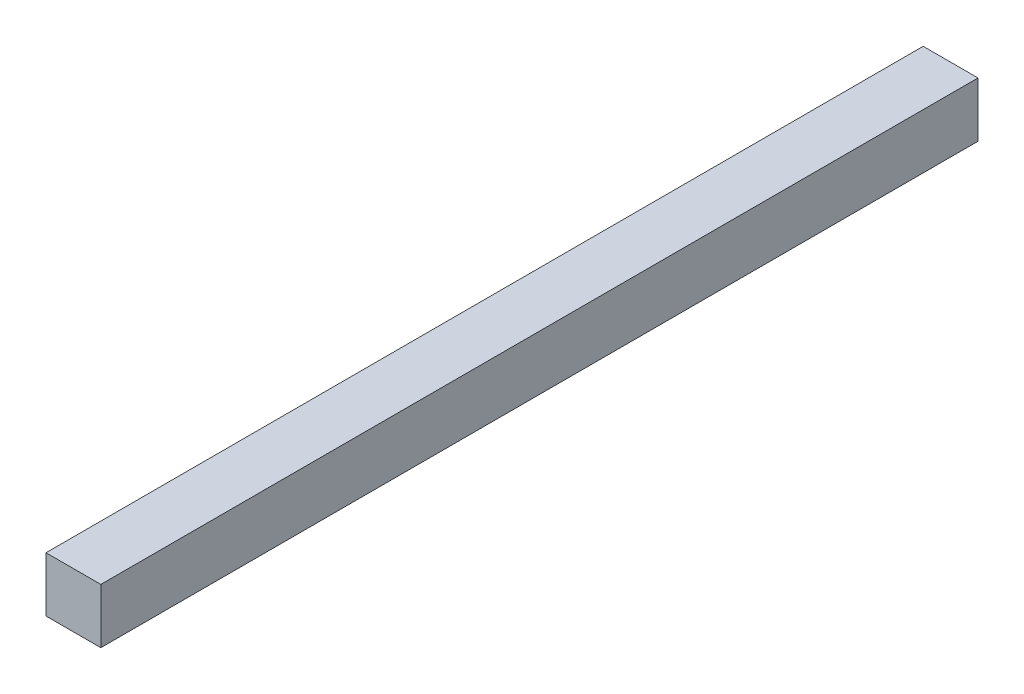
ISO-10303-21;
HEADER;
FILE_DESCRIPTION(('STEP AP214'),'2;1');
FILE_NAME('part.step','',(''),(''),'','','');
FILE_SCHEMA(('AUTOMOTIVE_DESIGN { 1 0 10303 214 1 1 1 1 }'));
ENDSEC;
DATA;
#1=APPLICATION_CONTEXT('core data for automotive mechanical design processes');
#2=APPLICATION_PROTOCOL_DEFINITION('international standard','automotive_design',2000,#1);
#3=PRODUCT_CONTEXT('',#1,'mechanical');
#4=PRODUCT('Part','Part','',(#3));
#5=PRODUCT_RELATED_PRODUCT_CATEGORY('part','',(#4));
#6=PRODUCT_DEFINITION_FORMATION('','',#4);
#7=PRODUCT_DEFINITION_CONTEXT('part definition',#1,'design');
#8=PRODUCT_DEFINITION('design','',#6,#7);
#9=PRODUCT_DEFINITION_SHAPE('','',#8);
#10=(LENGTH_UNIT() NAMED_UNIT(*) SI_UNIT(.MILLI.,.METRE.));
#11=(NAMED_UNIT(*) PLANE_ANGLE_UNIT() SI_UNIT($,.RADIAN.));
#12=(NAMED_UNIT(*) SI_UNIT($,.STERADIAN.) SOLID_ANGLE_UNIT());
#13=UNCERTAINTY_MEASURE_WITH_UNIT(LENGTH_MEASURE(1.E-05),#10,'distance_accuracy_value','');
#14=(GEOMETRIC_REPRESENTATION_CONTEXT(3) GLOBAL_UNCERTAINTY_ASSIGNED_CONTEXT((#13)) GLOBAL_UNIT_ASSIGNED_CONTEXT((#10,
#11,#12)) REPRESENTATION_CONTEXT('',''));
#15=CARTESIAN_POINT('',(0.,0.,0.));
#16=DIRECTION('',(0.,0.,1.));
#17=DIRECTION('',(1.,0.,0.));
#18=AXIS2_PLACEMENT_3D('',#15,#16,#17);
#19=CARTESIAN_POINT('',(-2.38125,-2.38125,76.2));
#20=DIRECTION('',(1.,0.,0.));
#21=DIRECTION('',(0.,0.,-1.));
#22=AXIS2_PLACEMENT_3D('',#19,#20,#21);
#23=PLANE('',#22);
#24=DIRECTION('',(0.,-1.,0.));
#25=VECTOR('',#24,1.);
#26=CARTESIAN_POINT('',(-2.38125,-2.38125,0.));
#27=LINE('',#26,#25);
#28=CARTESIAN_POINT('',(-2.38125,2.38125,0.));
#29=VERTEX_POINT('',#28);
#30=CARTESIAN_POINT('',(-2.38125,-2.38125,0.));
#31=VERTEX_POINT('',#30);
#32=EDGE_CURVE('E96',#29,#31,#27,.T.);
#33=ORIENTED_EDGE('',*,*,#32,.T.);
#34=DIRECTION('',(0.,0.,-1.));
#35=VECTOR('',#34,1.);
#36=CARTESIAN_POINT('',(-2.38125,-2.38125,76.2));
#37=LINE('',#36,#35);
#38=CARTESIAN_POINT('',(-2.38125,-2.38125,76.2));
#39=VERTEX_POINT('',#38);
#40=EDGE_CURVE('E11',#39,#31,#37,.T.);
#41=ORIENTED_EDGE('',*,*,#40,.F.);
#42=DIRECTION('',(0.,-1.,0.));
#43=VECTOR('',#42,1.);
#44=CARTESIAN_POINT('',(-2.38125,-2.38125,76.2));
#45=LINE('',#44,#43);
#46=CARTESIAN_POINT('',(-2.38125,2.38125,76.2));
#47=VERTEX_POINT('',#46);
#48=EDGE_CURVE('E84',#47,#39,#45,.T.);
#49=ORIENTED_EDGE('',*,*,#48,.F.);
#50=DIRECTION('',(0.,0.,-1.));
#51=VECTOR('',#50,1.);
#52=CARTESIAN_POINT('',(-2.38125,2.38125,76.2));
#53=LINE('',#52,#51);
#54=EDGE_CURVE('E92',#47,#29,#53,.T.);
#55=ORIENTED_EDGE('',*,*,#54,.T.);
#56=EDGE_LOOP('',(#33,#41,#49,#55));
#57=FACE_BOUND('',#56,.T.);
#58=ADVANCED_FACE('F33',(#57),#23,.F.);
#59=CARTESIAN_POINT('',(2.38125,-2.38125,76.2));
#60=DIRECTION('',(0.,1.,0.));
#61=DIRECTION('',(0.,0.,1.));
#62=AXIS2_PLACEMENT_3D('',#59,#60,#61);
#63=PLANE('',#62);
#64=DIRECTION('',(1.,0.,0.));
#65=VECTOR('',#64,1.);
#66=CARTESIAN_POINT('',(2.38125,-2.38125,0.));
#67=LINE('',#66,#65);
#68=CARTESIAN_POINT('',(2.38125,-2.38125,0.));
#69=VERTEX_POINT('',#68);
#70=EDGE_CURVE('E88',#31,#69,#67,.T.);
#71=ORIENTED_EDGE('',*,*,#70,.T.);
#72=DIRECTION('',(0.,0.,-1.));
#73=VECTOR('',#72,1.);
#74=CARTESIAN_POINT('',(2.38125,-2.38125,76.2));
#75=LINE('',#74,#73);
#76=CARTESIAN_POINT('',(2.38125,-2.38125,76.2));
#77=VERTEX_POINT('',#76);
#78=EDGE_CURVE('E41',#77,#69,#75,.T.);
#79=ORIENTED_EDGE('',*,*,#78,.F.);
#80=DIRECTION('',(1.,0.,0.));
#81=VECTOR('',#80,1.);
#82=CARTESIAN_POINT('',(2.38125,-2.38125,76.2));
#83=LINE('',#82,#81);
#84=EDGE_CURVE('E79',#39,#77,#83,.T.);
#85=ORIENTED_EDGE('',*,*,#84,.F.);
#86=ORIENTED_EDGE('',*,*,#40,.T.);
#87=EDGE_LOOP('',(#71,#79,#85,#86));
#88=FACE_BOUND('',#87,.T.);
#89=ADVANCED_FACE('F87',(#88),#63,.F.);
#90=CARTESIAN_POINT('',(2.38125,-2.38125,76.2));
#91=DIRECTION('',(-1.,0.,0.));
#92=DIRECTION('',(0.,0.,1.));
#93=AXIS2_PLACEMENT_3D('',#90,#91,#92);
#94=PLANE('',#93);
#95=DIRECTION('',(0.,1.,0.));
#96=VECTOR('',#95,1.);
#97=CARTESIAN_POINT('',(2.38125,-2.38125,0.));
#98=LINE('',#97,#96);
#99=CARTESIAN_POINT('',(2.38125,2.38125,0.));
#100=VERTEX_POINT('',#99);
#101=EDGE_CURVE('E66',#69,#100,#98,.T.);
#102=ORIENTED_EDGE('',*,*,#101,.T.);
#103=DIRECTION('',(0.,0.,-1.));
#104=VECTOR('',#103,1.);
#105=CARTESIAN_POINT('',(2.38125,2.38125,76.2));
#106=LINE('',#105,#104);
#107=CARTESIAN_POINT('',(2.38125,2.38125,76.2));
#108=VERTEX_POINT('',#107);
#109=EDGE_CURVE('E89',#108,#100,#106,.T.);
#110=ORIENTED_EDGE('',*,*,#109,.F.);
#111=DIRECTION('',(0.,1.,0.));
#112=VECTOR('',#111,1.);
#113=CARTESIAN_POINT('',(2.38125,-2.38125,76.2));
#114=LINE('',#113,#112);
#115=EDGE_CURVE('E82',#77,#108,#114,.T.);
#116=ORIENTED_EDGE('',*,*,#115,.F.);
#117=ORIENTED_EDGE('',*,*,#78,.T.);
#118=EDGE_LOOP('',(#102,#110,#116,#117));
#119=FACE_BOUND('',#118,.T.);
#120=ADVANCED_FACE('F90',(#119),#94,.F.);
#121=CARTESIAN_POINT('',(2.38125,2.38125,76.2));
#122=DIRECTION('',(0.,-1.,0.));
#123=DIRECTION('',(1.,0.,0.));
#124=AXIS2_PLACEMENT_3D('',#121,#122,#123);
#125=PLANE('',#124);
#126=DIRECTION('',(-1.,0.,0.));
#127=VECTOR('',#126,1.);
#128=CARTESIAN_POINT('',(2.38125,2.38125,0.));
#129=LINE('',#128,#127);
#130=EDGE_CURVE('E72',#100,#29,#129,.T.);
#131=ORIENTED_EDGE('',*,*,#130,.T.);
#132=ORIENTED_EDGE('',*,*,#54,.F.);
#133=DIRECTION('',(-1.,0.,0.));
#134=VECTOR('',#133,1.);
#135=CARTESIAN_POINT('',(2.38125,2.38125,76.2));
#136=LINE('',#135,#134);
#137=EDGE_CURVE('E49',#108,#47,#136,.T.);
#138=ORIENTED_EDGE('',*,*,#137,.F.);
#139=ORIENTED_EDGE('',*,*,#109,.T.);
#140=EDGE_LOOP('',(#131,#132,#138,#139));
#141=FACE_BOUND('',#140,.T.);
#142=ADVANCED_FACE('F103',(#141),#125,.F.);
#143=CARTESIAN_POINT('',(0.,0.,76.2));
#144=DIRECTION('',(0.,0.,1.));
#145=DIRECTION('',(1.,0.,0.));
#146=AXIS2_PLACEMENT_3D('',#143,#144,#145);
#147=PLANE('',#146);
#148=ORIENTED_EDGE('',*,*,#48,.T.);
#149=ORIENTED_EDGE('',*,*,#84,.T.);
#150=ORIENTED_EDGE('',*,*,#115,.T.);
#151=ORIENTED_EDGE('',*,*,#137,.T.);
#152=EDGE_LOOP('',(#148,#149,#150,#151));
#153=FACE_BOUND('',#152,.T.);
#154=ADVANCED_FACE('F80',(#153),#147,.T.);
#155=CARTESIAN_POINT('',(0.,0.,0.));
#156=DIRECTION('',(0.,0.,1.));
#157=DIRECTION('',(1.,0.,0.));
#158=AXIS2_PLACEMENT_3D('',#155,#156,#157);
#159=PLANE('',#158);
#160=ORIENTED_EDGE('',*,*,#32,.F.);
#161=ORIENTED_EDGE('',*,*,#130,.F.);
#162=ORIENTED_EDGE('',*,*,#101,.F.);
#163=ORIENTED_EDGE('',*,*,#70,.F.);
#164=EDGE_LOOP('',(#160,#161,#162,#163));
#165=FACE_BOUND('',#164,.T.);
#166=ADVANCED_FACE('F106',(#165),#159,.F.);
#167=CLOSED_SHELL('',(#58,#89,#120,#142,#154,#166));
#168=MANIFOLD_SOLID_BREP('B2',#167);
#169=ADVANCED_BREP_SHAPE_REPRESENTATION('',(#18,#168),#14);
#170=SHAPE_DEFINITION_REPRESENTATION(#9,#169);
ENDSEC;
END-ISO-10303-21;
